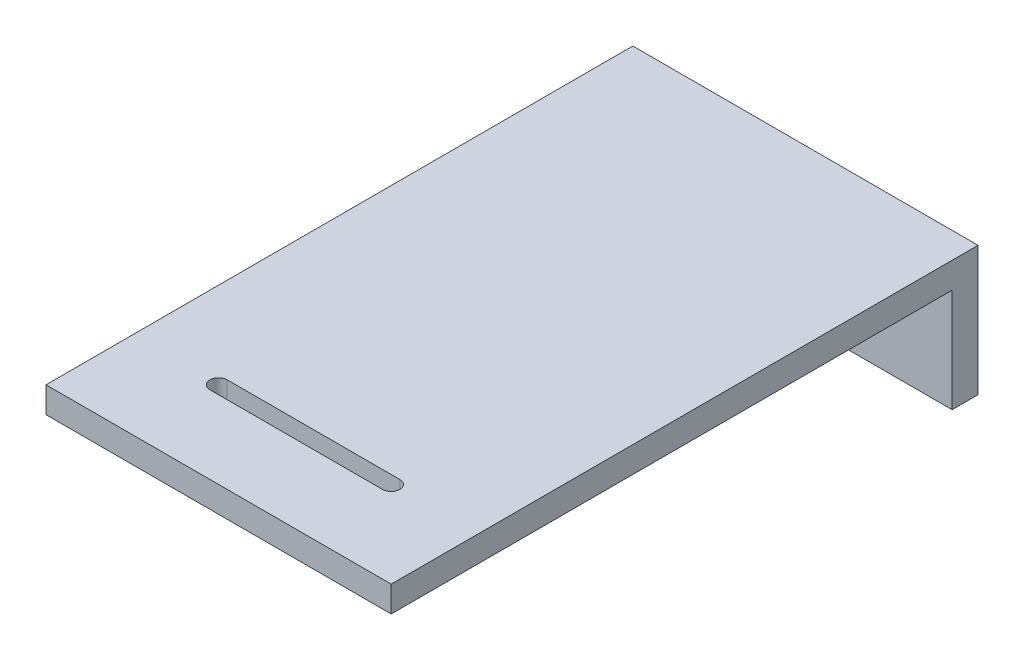
ISO-10303-21;
HEADER;
FILE_DESCRIPTION(('STEP AP214'),'2;1');
FILE_NAME('part.step','',(''),(''),'','','');
FILE_SCHEMA(('AUTOMOTIVE_DESIGN { 1 0 10303 214 1 1 1 1 }'));
ENDSEC;
DATA;
#1=APPLICATION_CONTEXT('core data for automotive mechanical design processes');
#2=APPLICATION_PROTOCOL_DEFINITION('international standard','automotive_design',2000,#1);
#3=PRODUCT_CONTEXT('',#1,'mechanical');
#4=PRODUCT('Part','Part','',(#3));
#5=PRODUCT_RELATED_PRODUCT_CATEGORY('part','',(#4));
#6=PRODUCT_DEFINITION_FORMATION('','',#4);
#7=PRODUCT_DEFINITION_CONTEXT('part definition',#1,'design');
#8=PRODUCT_DEFINITION('design','',#6,#7);
#9=PRODUCT_DEFINITION_SHAPE('','',#8);
#10=(LENGTH_UNIT() NAMED_UNIT(*) SI_UNIT(.MILLI.,.METRE.));
#11=(NAMED_UNIT(*) PLANE_ANGLE_UNIT() SI_UNIT($,.RADIAN.));
#12=(NAMED_UNIT(*) SI_UNIT($,.STERADIAN.) SOLID_ANGLE_UNIT());
#13=UNCERTAINTY_MEASURE_WITH_UNIT(LENGTH_MEASURE(1.E-05),#10,'distance_accuracy_value','');
#14=(GEOMETRIC_REPRESENTATION_CONTEXT(3) GLOBAL_UNCERTAINTY_ASSIGNED_CONTEXT((#13)) GLOBAL_UNIT_ASSIGNED_CONTEXT((#10,
#11,#12)) REPRESENTATION_CONTEXT('',''));
#15=CARTESIAN_POINT('',(0.,0.,0.));
#16=DIRECTION('',(0.,0.,1.));
#17=DIRECTION('',(1.,0.,0.));
#18=AXIS2_PLACEMENT_3D('',#15,#16,#17);
#19=CARTESIAN_POINT('',(0.,0.,3.));
#20=DIRECTION('',(0.,0.,1.));
#21=DIRECTION('',(1.,0.,0.));
#22=AXIS2_PLACEMENT_3D('',#19,#20,#21);
#23=PLANE('',#22);
#24=DIRECTION('',(1.,0.,0.));
#25=VECTOR('',#24,1.);
#26=CARTESIAN_POINT('',(-20.,4.5,3.));
#27=LINE('',#26,#25);
#28=CARTESIAN_POINT('',(-20.,4.5,3.));
#29=VERTEX_POINT('',#28);
#30=CARTESIAN_POINT('',(20.,4.5,3.));
#31=VERTEX_POINT('',#30);
#32=EDGE_CURVE('E151',#29,#31,#27,.T.);
#33=ORIENTED_EDGE('',*,*,#32,.F.);
#34=DIRECTION('',(0.,-1.,0.));
#35=VECTOR('',#34,1.);
#36=CARTESIAN_POINT('',(-20.,7.5,3.));
#37=LINE('',#36,#35);
#38=CARTESIAN_POINT('',(-20.,-7.5,3.));
#39=VERTEX_POINT('',#38);
#40=EDGE_CURVE('E172',#29,#39,#37,.T.);
#41=ORIENTED_EDGE('',*,*,#40,.T.);
#42=DIRECTION('',(1.,0.,0.));
#43=VECTOR('',#42,1.);
#44=CARTESIAN_POINT('',(-20.,-7.5,3.));
#45=LINE('',#44,#43);
#46=CARTESIAN_POINT('',(20.,-7.5,3.));
#47=VERTEX_POINT('',#46);
#48=EDGE_CURVE('E208',#39,#47,#45,.T.);
#49=ORIENTED_EDGE('',*,*,#48,.T.);
#50=DIRECTION('',(0.,1.,0.));
#51=VECTOR('',#50,1.);
#52=CARTESIAN_POINT('',(20.,7.5,3.));
#53=LINE('',#52,#51);
#54=EDGE_CURVE('E197',#47,#31,#53,.T.);
#55=ORIENTED_EDGE('',*,*,#54,.T.);
#56=EDGE_LOOP('',(#33,#41,#49,#55));
#57=FACE_BOUND('',#56,.T.);
#58=CARTESIAN_POINT('',(-10.,-2.5,3.));
#59=DIRECTION('',(0.,0.,1.));
#60=DIRECTION('',(1.,0.,0.));
#61=AXIS2_PLACEMENT_3D('',#58,#59,#60);
#62=CIRCLE('',#61,2.);
#63=CARTESIAN_POINT('',(-8.,-2.5,3.));
#64=VERTEX_POINT('',#63);
#65=EDGE_CURVE('E188',#64,#64,#62,.T.);
#66=ORIENTED_EDGE('',*,*,#65,.F.);
#67=EDGE_LOOP('',(#66));
#68=FACE_BOUND('',#67,.T.);
#69=CARTESIAN_POINT('',(10.,-2.5,3.));
#70=DIRECTION('',(0.,0.,1.));
#71=DIRECTION('',(1.,0.,0.));
#72=AXIS2_PLACEMENT_3D('',#69,#70,#71);
#73=CIRCLE('',#72,2.);
#74=CARTESIAN_POINT('',(12.,-2.5,3.));
#75=VERTEX_POINT('',#74);
#76=EDGE_CURVE('E166',#75,#75,#73,.T.);
#77=ORIENTED_EDGE('',*,*,#76,.F.);
#78=EDGE_LOOP('',(#77));
#79=FACE_BOUND('',#78,.T.);
#80=ADVANCED_FACE('F35',(#57,#68,#79),#23,.T.);
#81=CARTESIAN_POINT('',(0.,0.,0.));
#82=DIRECTION('',(0.,0.,1.));
#83=DIRECTION('',(1.,0.,0.));
#84=AXIS2_PLACEMENT_3D('',#81,#82,#83);
#85=PLANE('',#84);
#86=CARTESIAN_POINT('',(-10.,-2.5,0.));
#87=DIRECTION('',(0.,0.,1.));
#88=DIRECTION('',(1.,0.,0.));
#89=AXIS2_PLACEMENT_3D('',#86,#87,#88);
#90=CIRCLE('',#89,2.);
#91=CARTESIAN_POINT('',(-8.,-2.5,0.));
#92=VERTEX_POINT('',#91);
#93=EDGE_CURVE('E186',#92,#92,#90,.T.);
#94=ORIENTED_EDGE('',*,*,#93,.T.);
#95=EDGE_LOOP('',(#94));
#96=FACE_BOUND('',#95,.T.);
#97=DIRECTION('',(0.,1.,0.));
#98=VECTOR('',#97,1.);
#99=CARTESIAN_POINT('',(20.,7.5,0.));
#100=LINE('',#99,#98);
#101=CARTESIAN_POINT('',(20.,-7.5,0.));
#102=VERTEX_POINT('',#101);
#103=CARTESIAN_POINT('',(20.,7.5,0.));
#104=VERTEX_POINT('',#103);
#105=EDGE_CURVE('E191',#102,#104,#100,.T.);
#106=ORIENTED_EDGE('',*,*,#105,.F.);
#107=DIRECTION('',(1.,0.,0.));
#108=VECTOR('',#107,1.);
#109=CARTESIAN_POINT('',(-20.,-7.5,0.));
#110=LINE('',#109,#108);
#111=CARTESIAN_POINT('',(-20.,-7.5,0.));
#112=VERTEX_POINT('',#111);
#113=EDGE_CURVE('E198',#112,#102,#110,.T.);
#114=ORIENTED_EDGE('',*,*,#113,.F.);
#115=DIRECTION('',(0.,-1.,0.));
#116=VECTOR('',#115,1.);
#117=CARTESIAN_POINT('',(-20.,7.5,0.));
#118=LINE('',#117,#116);
#119=CARTESIAN_POINT('',(-20.,7.5,0.));
#120=VERTEX_POINT('',#119);
#121=EDGE_CURVE('E210',#120,#112,#118,.T.);
#122=ORIENTED_EDGE('',*,*,#121,.F.);
#123=DIRECTION('',(-1.,0.,0.));
#124=VECTOR('',#123,1.);
#125=CARTESIAN_POINT('',(-20.,7.5,0.));
#126=LINE('',#125,#124);
#127=EDGE_CURVE('E212',#104,#120,#126,.T.);
#128=ORIENTED_EDGE('',*,*,#127,.F.);
#129=EDGE_LOOP('',(#106,#114,#122,#128));
#130=FACE_BOUND('',#129,.T.);
#131=CARTESIAN_POINT('',(10.,-2.5,0.));
#132=DIRECTION('',(0.,0.,1.));
#133=DIRECTION('',(1.,0.,0.));
#134=AXIS2_PLACEMENT_3D('',#131,#132,#133);
#135=CIRCLE('',#134,2.);
#136=CARTESIAN_POINT('',(12.,-2.5,0.));
#137=VERTEX_POINT('',#136);
#138=EDGE_CURVE('E180',#137,#137,#135,.T.);
#139=ORIENTED_EDGE('',*,*,#138,.T.);
#140=EDGE_LOOP('',(#139));
#141=FACE_BOUND('',#140,.T.);
#142=ADVANCED_FACE('F239',(#96,#130,#141),#85,.F.);
#143=CARTESIAN_POINT('',(20.,7.5,3.));
#144=DIRECTION('',(-1.,0.,0.));
#145=DIRECTION('',(0.,-1.,0.));
#146=AXIS2_PLACEMENT_3D('',#143,#144,#145);
#147=PLANE('',#146);
#148=ORIENTED_EDGE('',*,*,#105,.T.);
#149=DIRECTION('',(0.,0.,-1.));
#150=VECTOR('',#149,1.);
#151=CARTESIAN_POINT('',(20.,7.5,3.));
#152=LINE('',#151,#150);
#153=CARTESIAN_POINT('',(20.,7.5,68.));
#154=VERTEX_POINT('',#153);
#155=EDGE_CURVE('E11',#154,#104,#152,.T.);
#156=ORIENTED_EDGE('',*,*,#155,.F.);
#157=DIRECTION('',(0.,1.,0.));
#158=VECTOR('',#157,1.);
#159=CARTESIAN_POINT('',(20.,7.5,68.));
#160=LINE('',#159,#158);
#161=CARTESIAN_POINT('',(20.,4.5,68.));
#162=VERTEX_POINT('',#161);
#163=EDGE_CURVE('E157',#162,#154,#160,.T.);
#164=ORIENTED_EDGE('',*,*,#163,.F.);
#165=DIRECTION('',(0.,0.,-1.));
#166=VECTOR('',#165,1.);
#167=CARTESIAN_POINT('',(20.,4.5,68.));
#168=LINE('',#167,#166);
#169=EDGE_CURVE('E163',#162,#31,#168,.T.);
#170=ORIENTED_EDGE('',*,*,#169,.T.);
#171=ORIENTED_EDGE('',*,*,#54,.F.);
#172=DIRECTION('',(0.,0.,-1.));
#173=VECTOR('',#172,1.);
#174=CARTESIAN_POINT('',(20.,-7.5,3.));
#175=LINE('',#174,#173);
#176=EDGE_CURVE('E205',#47,#102,#175,.T.);
#177=ORIENTED_EDGE('',*,*,#176,.T.);
#178=EDGE_LOOP('',(#148,#156,#164,#170,#171,#177));
#179=FACE_BOUND('',#178,.T.);
#180=ADVANCED_FACE('F37',(#179),#147,.F.);
#181=CARTESIAN_POINT('',(-20.,7.5,3.));
#182=DIRECTION('',(0.,-1.,0.));
#183=DIRECTION('',(0.,0.,-1.));
#184=AXIS2_PLACEMENT_3D('',#181,#182,#183);
#185=PLANE('',#184);
#186=DIRECTION('',(-1.,0.,0.));
#187=VECTOR('',#186,1.);
#188=CARTESIAN_POINT('',(-20.,7.5,59.));
#189=LINE('',#188,#187);
#190=CARTESIAN_POINT('',(10.,7.5,59.));
#191=VERTEX_POINT('',#190);
#192=CARTESIAN_POINT('',(-10.,7.5,59.));
#193=VERTEX_POINT('',#192);
#194=EDGE_CURVE('E145',#191,#193,#189,.T.);
#195=ORIENTED_EDGE('',*,*,#194,.T.);
#196=CARTESIAN_POINT('',(-10.,7.5,58.));
#197=DIRECTION('',(0.,-1.,0.));
#198=DIRECTION('',(0.,0.,-1.));
#199=AXIS2_PLACEMENT_3D('',#196,#197,#198);
#200=CIRCLE('',#199,1.00000000000001);
#201=CARTESIAN_POINT('',(-10.,7.5,57.));
#202=VERTEX_POINT('',#201);
#203=EDGE_CURVE('E148',#193,#202,#200,.T.);
#204=ORIENTED_EDGE('',*,*,#203,.T.);
#205=DIRECTION('',(1.,0.,0.));
#206=VECTOR('',#205,1.);
#207=CARTESIAN_POINT('',(-20.,7.5,57.));
#208=LINE('',#207,#206);
#209=CARTESIAN_POINT('',(10.,7.5,57.));
#210=VERTEX_POINT('',#209);
#211=EDGE_CURVE('E140',#202,#210,#208,.T.);
#212=ORIENTED_EDGE('',*,*,#211,.T.);
#213=CARTESIAN_POINT('',(10.,7.5,58.));
#214=DIRECTION('',(0.,-1.,0.));
#215=DIRECTION('',(0.,0.,-1.));
#216=AXIS2_PLACEMENT_3D('',#213,#214,#215);
#217=CIRCLE('',#216,1.00000000000001);
#218=EDGE_CURVE('E120',#210,#191,#217,.T.);
#219=ORIENTED_EDGE('',*,*,#218,.T.);
#220=EDGE_LOOP('',(#195,#204,#212,#219));
#221=FACE_BOUND('',#220,.T.);
#222=ORIENTED_EDGE('',*,*,#127,.T.);
#223=DIRECTION('',(0.,0.,-1.));
#224=VECTOR('',#223,1.);
#225=CARTESIAN_POINT('',(-20.,7.5,3.));
#226=LINE('',#225,#224);
#227=CARTESIAN_POINT('',(-20.,7.5,68.));
#228=VERTEX_POINT('',#227);
#229=EDGE_CURVE('E44',#228,#120,#226,.T.);
#230=ORIENTED_EDGE('',*,*,#229,.F.);
#231=DIRECTION('',(-1.,0.,0.));
#232=VECTOR('',#231,1.);
#233=CARTESIAN_POINT('',(-20.,7.5,68.));
#234=LINE('',#233,#232);
#235=EDGE_CURVE('E160',#154,#228,#234,.T.);
#236=ORIENTED_EDGE('',*,*,#235,.F.);
#237=ORIENTED_EDGE('',*,*,#155,.T.);
#238=EDGE_LOOP('',(#222,#230,#236,#237));
#239=FACE_BOUND('',#238,.T.);
#240=ADVANCED_FACE('F237',(#221,#239),#185,.F.);
#241=CARTESIAN_POINT('',(-20.,7.5,3.));
#242=DIRECTION('',(1.,0.,0.));
#243=DIRECTION('',(0.,1.,0.));
#244=AXIS2_PLACEMENT_3D('',#241,#242,#243);
#245=PLANE('',#244);
#246=ORIENTED_EDGE('',*,*,#121,.T.);
#247=DIRECTION('',(0.,0.,-1.));
#248=VECTOR('',#247,1.);
#249=CARTESIAN_POINT('',(-20.,-7.5,3.));
#250=LINE('',#249,#248);
#251=EDGE_CURVE('E202',#39,#112,#250,.T.);
#252=ORIENTED_EDGE('',*,*,#251,.F.);
#253=ORIENTED_EDGE('',*,*,#40,.F.);
#254=DIRECTION('',(0.,0.,-1.));
#255=VECTOR('',#254,1.);
#256=CARTESIAN_POINT('',(-20.,4.5,68.));
#257=LINE('',#256,#255);
#258=CARTESIAN_POINT('',(-20.,4.5,68.));
#259=VERTEX_POINT('',#258);
#260=EDGE_CURVE('E177',#259,#29,#257,.T.);
#261=ORIENTED_EDGE('',*,*,#260,.F.);
#262=DIRECTION('',(0.,-1.,0.));
#263=VECTOR('',#262,1.);
#264=CARTESIAN_POINT('',(-20.,7.5,68.));
#265=LINE('',#264,#263);
#266=EDGE_CURVE('E152',#228,#259,#265,.T.);
#267=ORIENTED_EDGE('',*,*,#266,.F.);
#268=ORIENTED_EDGE('',*,*,#229,.T.);
#269=EDGE_LOOP('',(#246,#252,#253,#261,#267,#268));
#270=FACE_BOUND('',#269,.T.);
#271=ADVANCED_FACE('F222',(#270),#245,.F.);
#272=CARTESIAN_POINT('',(-20.,-7.5,3.));
#273=DIRECTION('',(0.,1.,0.));
#274=DIRECTION('',(0.,0.,1.));
#275=AXIS2_PLACEMENT_3D('',#272,#273,#274);
#276=PLANE('',#275);
#277=ORIENTED_EDGE('',*,*,#113,.T.);
#278=ORIENTED_EDGE('',*,*,#176,.F.);
#279=ORIENTED_EDGE('',*,*,#48,.F.);
#280=ORIENTED_EDGE('',*,*,#251,.T.);
#281=EDGE_LOOP('',(#277,#278,#279,#280));
#282=FACE_BOUND('',#281,.T.);
#283=ADVANCED_FACE('F226',(#282),#276,.F.);
#284=CARTESIAN_POINT('',(-10.,-2.5,3.));
#285=DIRECTION('',(0.,0.,-1.));
#286=DIRECTION('',(-1.,0.,0.));
#287=AXIS2_PLACEMENT_3D('',#284,#285,#286);
#288=CYLINDRICAL_SURFACE('',#287,2.);
#289=ORIENTED_EDGE('',*,*,#65,.T.);
#290=EDGE_LOOP('',(#289));
#291=FACE_BOUND('',#290,.T.);
#292=ORIENTED_EDGE('',*,*,#93,.F.);
#293=EDGE_LOOP('',(#292));
#294=FACE_BOUND('',#293,.T.);
#295=ADVANCED_FACE('F252',(#291,#294),#288,.F.);
#296=CARTESIAN_POINT('',(10.,-2.5,3.));
#297=DIRECTION('',(0.,0.,-1.));
#298=DIRECTION('',(-1.,0.,0.));
#299=AXIS2_PLACEMENT_3D('',#296,#297,#298);
#300=CYLINDRICAL_SURFACE('',#299,2.);
#301=ORIENTED_EDGE('',*,*,#76,.T.);
#302=EDGE_LOOP('',(#301));
#303=FACE_BOUND('',#302,.T.);
#304=ORIENTED_EDGE('',*,*,#138,.F.);
#305=EDGE_LOOP('',(#304));
#306=FACE_BOUND('',#305,.T.);
#307=ADVANCED_FACE('F275',(#303,#306),#300,.F.);
#308=CARTESIAN_POINT('',(-20.,4.5,68.));
#309=DIRECTION('',(0.,1.,0.));
#310=DIRECTION('',(-1.,0.,0.));
#311=AXIS2_PLACEMENT_3D('',#308,#309,#310);
#312=PLANE('',#311);
#313=DIRECTION('',(1.,0.,0.));
#314=VECTOR('',#313,1.);
#315=CARTESIAN_POINT('',(-10.,4.5,57.));
#316=LINE('',#315,#314);
#317=CARTESIAN_POINT('',(-10.,4.5,57.));
#318=VERTEX_POINT('',#317);
#319=CARTESIAN_POINT('',(10.,4.5,57.));
#320=VERTEX_POINT('',#319);
#321=EDGE_CURVE('E126',#318,#320,#316,.T.);
#322=ORIENTED_EDGE('',*,*,#321,.F.);
#323=CARTESIAN_POINT('',(-10.,4.5,58.));
#324=DIRECTION('',(0.,-1.,0.));
#325=DIRECTION('',(0.,0.,-1.));
#326=AXIS2_PLACEMENT_3D('',#323,#324,#325);
#327=CIRCLE('',#326,1.00000000000001);
#328=CARTESIAN_POINT('',(-10.,4.5,59.));
#329=VERTEX_POINT('',#328);
#330=EDGE_CURVE('E60',#329,#318,#327,.T.);
#331=ORIENTED_EDGE('',*,*,#330,.F.);
#332=DIRECTION('',(-1.,0.,0.));
#333=VECTOR('',#332,1.);
#334=CARTESIAN_POINT('',(-10.,4.5,59.));
#335=LINE('',#334,#333);
#336=CARTESIAN_POINT('',(10.,4.5,59.));
#337=VERTEX_POINT('',#336);
#338=EDGE_CURVE('E133',#337,#329,#335,.T.);
#339=ORIENTED_EDGE('',*,*,#338,.F.);
#340=CARTESIAN_POINT('',(10.,4.5,58.));
#341=DIRECTION('',(0.,-1.,0.));
#342=DIRECTION('',(0.,0.,-1.));
#343=AXIS2_PLACEMENT_3D('',#340,#341,#342);
#344=CIRCLE('',#343,1.00000000000001);
#345=EDGE_CURVE('E117',#320,#337,#344,.T.);
#346=ORIENTED_EDGE('',*,*,#345,.F.);
#347=EDGE_LOOP('',(#322,#331,#339,#346));
#348=FACE_BOUND('',#347,.T.);
#349=ORIENTED_EDGE('',*,*,#32,.T.);
#350=ORIENTED_EDGE('',*,*,#169,.F.);
#351=DIRECTION('',(1.,0.,0.));
#352=VECTOR('',#351,1.);
#353=CARTESIAN_POINT('',(-20.,4.5,68.));
#354=LINE('',#353,#352);
#355=EDGE_CURVE('E155',#259,#162,#354,.T.);
#356=ORIENTED_EDGE('',*,*,#355,.F.);
#357=ORIENTED_EDGE('',*,*,#260,.T.);
#358=EDGE_LOOP('',(#349,#350,#356,#357));
#359=FACE_BOUND('',#358,.T.);
#360=ADVANCED_FACE('F130',(#348,#359),#312,.F.);
#361=CARTESIAN_POINT('',(0.,0.,68.));
#362=DIRECTION('',(0.,0.,1.));
#363=DIRECTION('',(1.,0.,0.));
#364=AXIS2_PLACEMENT_3D('',#361,#362,#363);
#365=PLANE('',#364);
#366=ORIENTED_EDGE('',*,*,#266,.T.);
#367=ORIENTED_EDGE('',*,*,#355,.T.);
#368=ORIENTED_EDGE('',*,*,#163,.T.);
#369=ORIENTED_EDGE('',*,*,#235,.T.);
#370=EDGE_LOOP('',(#366,#367,#368,#369));
#371=FACE_BOUND('',#370,.T.);
#372=ADVANCED_FACE('F234',(#371),#365,.T.);
#373=CARTESIAN_POINT('',(-10.,69.5,58.));
#374=DIRECTION('',(0.,-1.,0.));
#375=DIRECTION('',(0.,0.,-1.));
#376=AXIS2_PLACEMENT_3D('',#373,#374,#375);
#377=CYLINDRICAL_SURFACE('',#376,1.00000000000001);
#378=DIRECTION('',(0.,-1.,0.));
#379=VECTOR('',#378,1.);
#380=CARTESIAN_POINT('',(-10.,69.5,59.));
#381=LINE('',#380,#379);
#382=EDGE_CURVE('E138',#193,#329,#381,.T.);
#383=ORIENTED_EDGE('',*,*,#382,.T.);
#384=ORIENTED_EDGE('',*,*,#330,.T.);
#385=DIRECTION('',(0.,-1.,0.));
#386=VECTOR('',#385,1.);
#387=CARTESIAN_POINT('',(-10.,69.5,57.));
#388=LINE('',#387,#386);
#389=EDGE_CURVE('E123',#202,#318,#388,.T.);
#390=ORIENTED_EDGE('',*,*,#389,.F.);
#391=ORIENTED_EDGE('',*,*,#203,.F.);
#392=EDGE_LOOP('',(#383,#384,#390,#391));
#393=FACE_BOUND('',#392,.T.);
#394=ADVANCED_FACE('F261',(#393),#377,.F.);
#395=CARTESIAN_POINT('',(-10.,69.5,59.));
#396=DIRECTION('',(0.,0.,1.));
#397=DIRECTION('',(1.,0.,0.));
#398=AXIS2_PLACEMENT_3D('',#395,#396,#397);
#399=PLANE('',#398);
#400=DIRECTION('',(0.,-1.,0.));
#401=VECTOR('',#400,1.);
#402=CARTESIAN_POINT('',(10.,69.5,59.));
#403=LINE('',#402,#401);
#404=EDGE_CURVE('E122',#191,#337,#403,.T.);
#405=ORIENTED_EDGE('',*,*,#404,.T.);
#406=ORIENTED_EDGE('',*,*,#338,.T.);
#407=ORIENTED_EDGE('',*,*,#382,.F.);
#408=ORIENTED_EDGE('',*,*,#194,.F.);
#409=EDGE_LOOP('',(#405,#406,#407,#408));
#410=FACE_BOUND('',#409,.T.);
#411=ADVANCED_FACE('F260',(#410),#399,.F.);
#412=CARTESIAN_POINT('',(10.,69.5,58.));
#413=DIRECTION('',(0.,-1.,0.));
#414=DIRECTION('',(0.,0.,-1.));
#415=AXIS2_PLACEMENT_3D('',#412,#413,#414);
#416=CYLINDRICAL_SURFACE('',#415,1.00000000000001);
#417=DIRECTION('',(0.,-1.,0.));
#418=VECTOR('',#417,1.);
#419=CARTESIAN_POINT('',(10.,69.5,57.));
#420=LINE('',#419,#418);
#421=EDGE_CURVE('E52',#210,#320,#420,.T.);
#422=ORIENTED_EDGE('',*,*,#421,.T.);
#423=ORIENTED_EDGE('',*,*,#345,.T.);
#424=ORIENTED_EDGE('',*,*,#404,.F.);
#425=ORIENTED_EDGE('',*,*,#218,.F.);
#426=EDGE_LOOP('',(#422,#423,#424,#425));
#427=FACE_BOUND('',#426,.T.);
#428=ADVANCED_FACE('F114',(#427),#416,.F.);
#429=CARTESIAN_POINT('',(-10.,69.5,57.));
#430=DIRECTION('',(0.,0.,-1.));
#431=DIRECTION('',(-1.,0.,0.));
#432=AXIS2_PLACEMENT_3D('',#429,#430,#431);
#433=PLANE('',#432);
#434=ORIENTED_EDGE('',*,*,#389,.T.);
#435=ORIENTED_EDGE('',*,*,#321,.T.);
#436=ORIENTED_EDGE('',*,*,#421,.F.);
#437=ORIENTED_EDGE('',*,*,#211,.F.);
#438=EDGE_LOOP('',(#434,#435,#436,#437));
#439=FACE_BOUND('',#438,.T.);
#440=ADVANCED_FACE('F127',(#439),#433,.F.);
#441=CLOSED_SHELL('',(#80,#142,#180,#240,#271,#283,#295,#307,#360,#372,#394,#411,#428,#440));
#442=MANIFOLD_SOLID_BREP('B2',#441);
#443=ADVANCED_BREP_SHAPE_REPRESENTATION('',(#18,#442),#14);
#444=SHAPE_DEFINITION_REPRESENTATION(#9,#443);
ENDSEC;
END-ISO-10303-21;
